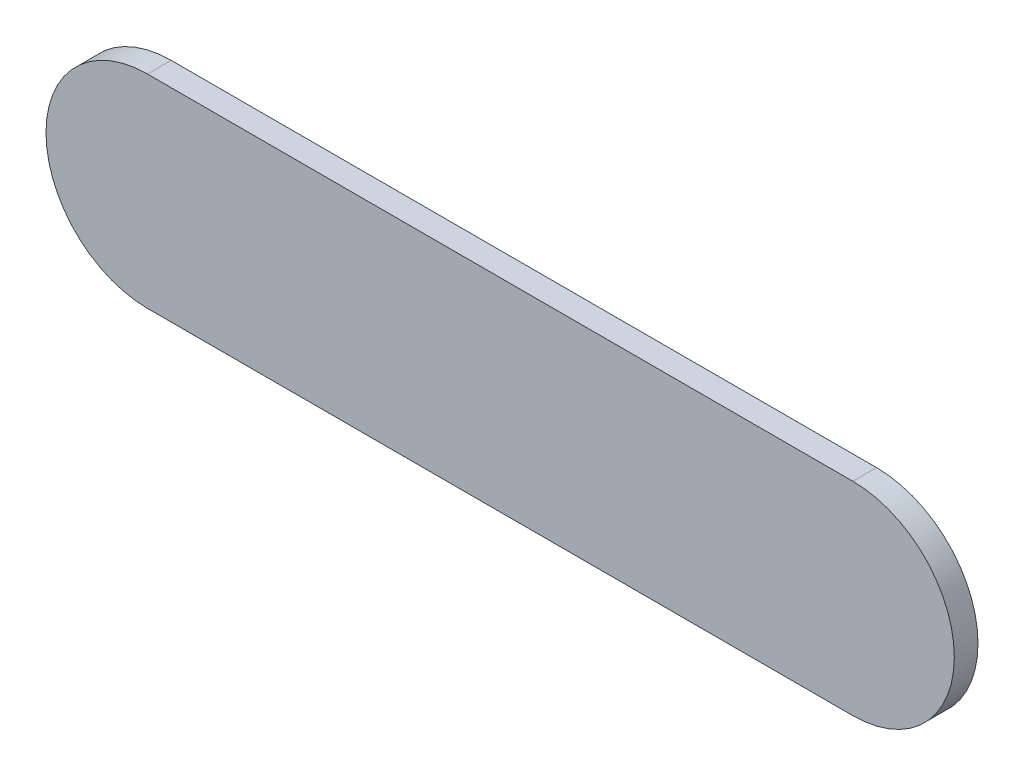
ISO-10303-21;
HEADER;
FILE_DESCRIPTION(('STEP AP214'),'2;1');
FILE_NAME('part.step','',(''),(''),'','','');
FILE_SCHEMA(('AUTOMOTIVE_DESIGN { 1 0 10303 214 1 1 1 1 }'));
ENDSEC;
DATA;
#1=APPLICATION_CONTEXT('core data for automotive mechanical design processes');
#2=APPLICATION_PROTOCOL_DEFINITION('international standard','automotive_design',2000,#1);
#3=PRODUCT_CONTEXT('',#1,'mechanical');
#4=PRODUCT('Part','Part','',(#3));
#5=PRODUCT_RELATED_PRODUCT_CATEGORY('part','',(#4));
#6=PRODUCT_DEFINITION_FORMATION('','',#4);
#7=PRODUCT_DEFINITION_CONTEXT('part definition',#1,'design');
#8=PRODUCT_DEFINITION('design','',#6,#7);
#9=PRODUCT_DEFINITION_SHAPE('','',#8);
#10=(LENGTH_UNIT() NAMED_UNIT(*) SI_UNIT(.MILLI.,.METRE.));
#11=(NAMED_UNIT(*) PLANE_ANGLE_UNIT() SI_UNIT($,.RADIAN.));
#12=(NAMED_UNIT(*) SI_UNIT($,.STERADIAN.) SOLID_ANGLE_UNIT());
#13=UNCERTAINTY_MEASURE_WITH_UNIT(LENGTH_MEASURE(1.E-05),#10,'distance_accuracy_value','');
#14=(GEOMETRIC_REPRESENTATION_CONTEXT(3) GLOBAL_UNCERTAINTY_ASSIGNED_CONTEXT((#13)) GLOBAL_UNIT_ASSIGNED_CONTEXT((#10,
#11,#12)) REPRESENTATION_CONTEXT('',''));
#15=CARTESIAN_POINT('',(0.,0.,0.));
#16=DIRECTION('',(0.,0.,1.));
#17=DIRECTION('',(1.,0.,0.));
#18=AXIS2_PLACEMENT_3D('',#15,#16,#17);
#19=CARTESIAN_POINT('',(123.0875,-66.15,1.635));
#20=DIRECTION('',(0.,0.,1.));
#21=DIRECTION('',(1.,0.,0.));
#22=AXIS2_PLACEMENT_3D('',#19,#20,#21);
#23=PLANE('',#22);
#24=DIRECTION('',(1.,0.,0.));
#25=VECTOR('',#24,1.);
#26=CARTESIAN_POINT('',(123.0875,-66.15,1.635));
#27=LINE('',#26,#25);
#28=CARTESIAN_POINT('',(123.0875,-66.15,1.635));
#29=VERTEX_POINT('',#28);
#30=CARTESIAN_POINT('',(124.13,-66.15,1.635));
#31=VERTEX_POINT('',#30);
#32=EDGE_CURVE('E99',#29,#31,#27,.T.);
#33=ORIENTED_EDGE('',*,*,#32,.T.);
#34=CARTESIAN_POINT('',(124.13,-66.,1.635));
#35=DIRECTION('',(0.,0.,1.));
#36=DIRECTION('',(0.,-1.,0.));
#37=AXIS2_PLACEMENT_3D('',#34,#35,#36);
#38=CIRCLE('',#37,0.15);
#39=CARTESIAN_POINT('',(124.13,-65.85,1.635));
#40=VERTEX_POINT('',#39);
#41=EDGE_CURVE('E79',#31,#40,#38,.T.);
#42=ORIENTED_EDGE('',*,*,#41,.T.);
#43=DIRECTION('',(-1.,0.,0.));
#44=VECTOR('',#43,1.);
#45=CARTESIAN_POINT('',(124.13,-65.85,1.635));
#46=LINE('',#45,#44);
#47=CARTESIAN_POINT('',(123.0875,-65.85,1.635));
#48=VERTEX_POINT('',#47);
#49=EDGE_CURVE('E20',#40,#48,#46,.T.);
#50=ORIENTED_EDGE('',*,*,#49,.T.);
#51=CARTESIAN_POINT('',(123.0875,-66.,1.635));
#52=DIRECTION('',(0.,0.,1.));
#53=DIRECTION('',(0.,1.,0.));
#54=AXIS2_PLACEMENT_3D('',#51,#52,#53);
#55=CIRCLE('',#54,0.15);
#56=EDGE_CURVE('E11',#48,#29,#55,.T.);
#57=ORIENTED_EDGE('',*,*,#56,.T.);
#58=EDGE_LOOP('',(#33,#42,#50,#57));
#59=FACE_BOUND('',#58,.T.);
#60=ADVANCED_FACE('F17',(#59),#23,.T.);
#61=CARTESIAN_POINT('',(123.0875,-66.15,1.6));
#62=DIRECTION('',(0.,0.,1.));
#63=DIRECTION('',(1.,0.,0.));
#64=AXIS2_PLACEMENT_3D('',#61,#62,#63);
#65=PLANE('',#64);
#66=CARTESIAN_POINT('',(123.0875,-66.,1.6));
#67=DIRECTION('',(0.,0.,1.));
#68=DIRECTION('',(0.,1.,0.));
#69=AXIS2_PLACEMENT_3D('',#66,#67,#68);
#70=CIRCLE('',#69,0.15);
#71=CARTESIAN_POINT('',(123.0875,-65.85,1.6));
#72=VERTEX_POINT('',#71);
#73=CARTESIAN_POINT('',(123.0875,-66.15,1.6));
#74=VERTEX_POINT('',#73);
#75=EDGE_CURVE('E26',#72,#74,#70,.T.);
#76=ORIENTED_EDGE('',*,*,#75,.F.);
#77=DIRECTION('',(-1.,0.,0.));
#78=VECTOR('',#77,1.);
#79=CARTESIAN_POINT('',(124.13,-65.85,1.6));
#80=LINE('',#79,#78);
#81=CARTESIAN_POINT('',(124.13,-65.85,1.6));
#82=VERTEX_POINT('',#81);
#83=EDGE_CURVE('E69',#82,#72,#80,.T.);
#84=ORIENTED_EDGE('',*,*,#83,.F.);
#85=CARTESIAN_POINT('',(124.13,-66.,1.6));
#86=DIRECTION('',(0.,0.,1.));
#87=DIRECTION('',(0.,-1.,0.));
#88=AXIS2_PLACEMENT_3D('',#85,#86,#87);
#89=CIRCLE('',#88,0.15);
#90=CARTESIAN_POINT('',(124.13,-66.15,1.6));
#91=VERTEX_POINT('',#90);
#92=EDGE_CURVE('E73',#91,#82,#89,.T.);
#93=ORIENTED_EDGE('',*,*,#92,.F.);
#94=DIRECTION('',(1.,0.,0.));
#95=VECTOR('',#94,1.);
#96=CARTESIAN_POINT('',(123.0875,-66.15,1.6));
#97=LINE('',#96,#95);
#98=EDGE_CURVE('E103',#74,#91,#97,.T.);
#99=ORIENTED_EDGE('',*,*,#98,.F.);
#100=EDGE_LOOP('',(#76,#84,#93,#99));
#101=FACE_BOUND('',#100,.T.);
#102=ADVANCED_FACE('F71',(#101),#65,.F.);
#103=CARTESIAN_POINT('',(123.0875,-66.,1.6));
#104=DIRECTION('',(0.,0.,-1.));
#105=DIRECTION('',(0.,1.,0.));
#106=AXIS2_PLACEMENT_3D('',#103,#104,#105);
#107=CYLINDRICAL_SURFACE('',#106,0.15);
#108=ORIENTED_EDGE('',*,*,#75,.T.);
#109=DIRECTION('',(0.,0.,1.));
#110=VECTOR('',#109,1.);
#111=CARTESIAN_POINT('',(123.0875,-66.15,1.6));
#112=LINE('',#111,#110);
#113=EDGE_CURVE('E93',#74,#29,#112,.T.);
#114=ORIENTED_EDGE('',*,*,#113,.T.);
#115=ORIENTED_EDGE('',*,*,#56,.F.);
#116=DIRECTION('',(0.,0.,1.));
#117=VECTOR('',#116,1.);
#118=CARTESIAN_POINT('',(123.0875,-65.85,1.6));
#119=LINE('',#118,#117);
#120=EDGE_CURVE('E78',#72,#48,#119,.T.);
#121=ORIENTED_EDGE('',*,*,#120,.F.);
#122=EDGE_LOOP('',(#108,#114,#115,#121));
#123=FACE_BOUND('',#122,.T.);
#124=ADVANCED_FACE('F170',(#123),#107,.T.);
#125=CARTESIAN_POINT('',(124.13,-65.85,1.6));
#126=DIRECTION('',(0.,-1.,0.));
#127=DIRECTION('',(0.,0.,-1.));
#128=AXIS2_PLACEMENT_3D('',#125,#126,#127);
#129=PLANE('',#128);
#130=ORIENTED_EDGE('',*,*,#83,.T.);
#131=ORIENTED_EDGE('',*,*,#120,.T.);
#132=ORIENTED_EDGE('',*,*,#49,.F.);
#133=DIRECTION('',(0.,0.,1.));
#134=VECTOR('',#133,1.);
#135=CARTESIAN_POINT('',(124.13,-65.85,1.6));
#136=LINE('',#135,#134);
#137=EDGE_CURVE('E82',#82,#40,#136,.T.);
#138=ORIENTED_EDGE('',*,*,#137,.F.);
#139=EDGE_LOOP('',(#130,#131,#132,#138));
#140=FACE_BOUND('',#139,.T.);
#141=ADVANCED_FACE('F83',(#140),#129,.F.);
#142=CARTESIAN_POINT('',(124.13,-66.,1.6));
#143=DIRECTION('',(0.,0.,-1.));
#144=DIRECTION('',(0.,-1.,0.));
#145=AXIS2_PLACEMENT_3D('',#142,#143,#144);
#146=CYLINDRICAL_SURFACE('',#145,0.15);
#147=ORIENTED_EDGE('',*,*,#92,.T.);
#148=ORIENTED_EDGE('',*,*,#137,.T.);
#149=ORIENTED_EDGE('',*,*,#41,.F.);
#150=DIRECTION('',(0.,0.,1.));
#151=VECTOR('',#150,1.);
#152=CARTESIAN_POINT('',(124.13,-66.15,1.6));
#153=LINE('',#152,#151);
#154=EDGE_CURVE('E90',#91,#31,#153,.T.);
#155=ORIENTED_EDGE('',*,*,#154,.F.);
#156=EDGE_LOOP('',(#147,#148,#149,#155));
#157=FACE_BOUND('',#156,.T.);
#158=ADVANCED_FACE('F88',(#157),#146,.T.);
#159=CARTESIAN_POINT('',(123.0875,-66.15,1.6));
#160=DIRECTION('',(0.,1.,0.));
#161=DIRECTION('',(1.,0.,0.));
#162=AXIS2_PLACEMENT_3D('',#159,#160,#161);
#163=PLANE('',#162);
#164=ORIENTED_EDGE('',*,*,#98,.T.);
#165=ORIENTED_EDGE('',*,*,#154,.T.);
#166=ORIENTED_EDGE('',*,*,#32,.F.);
#167=ORIENTED_EDGE('',*,*,#113,.F.);
#168=EDGE_LOOP('',(#164,#165,#166,#167));
#169=FACE_BOUND('',#168,.T.);
#170=ADVANCED_FACE('F122',(#169),#163,.F.);
#171=CLOSED_SHELL('',(#60,#102,#124,#141,#158,#170));
#172=MANIFOLD_SOLID_BREP('B1',#171);
#173=ADVANCED_BREP_SHAPE_REPRESENTATION('',(#18,#172),#14);
#174=SHAPE_DEFINITION_REPRESENTATION(#9,#173);
ENDSEC;
END-ISO-10303-21;
